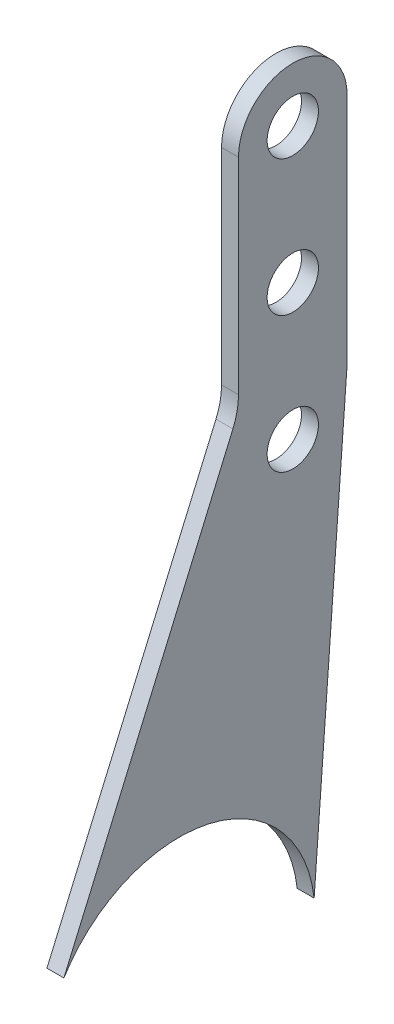
ISO-10303-21;
HEADER;
FILE_DESCRIPTION(('STEP AP214'),'2;1');
FILE_NAME('part.step','',(''),(''),'','','');
FILE_SCHEMA(('AUTOMOTIVE_DESIGN { 1 0 10303 214 1 1 1 1 }'));
ENDSEC;
DATA;
#1=APPLICATION_CONTEXT('core data for automotive mechanical design processes');
#2=APPLICATION_PROTOCOL_DEFINITION('international standard','automotive_design',2000,#1);
#3=PRODUCT_CONTEXT('',#1,'mechanical');
#4=PRODUCT('Part','Part','',(#3));
#5=PRODUCT_RELATED_PRODUCT_CATEGORY('part','',(#4));
#6=PRODUCT_DEFINITION_FORMATION('','',#4);
#7=PRODUCT_DEFINITION_CONTEXT('part definition',#1,'design');
#8=PRODUCT_DEFINITION('design','',#6,#7);
#9=PRODUCT_DEFINITION_SHAPE('','',#8);
#10=(LENGTH_UNIT() NAMED_UNIT(*) SI_UNIT(.MILLI.,.METRE.));
#11=(NAMED_UNIT(*) PLANE_ANGLE_UNIT() SI_UNIT($,.RADIAN.));
#12=(NAMED_UNIT(*) SI_UNIT($,.STERADIAN.) SOLID_ANGLE_UNIT());
#13=UNCERTAINTY_MEASURE_WITH_UNIT(LENGTH_MEASURE(1.E-05),#10,'distance_accuracy_value','');
#14=(GEOMETRIC_REPRESENTATION_CONTEXT(3) GLOBAL_UNCERTAINTY_ASSIGNED_CONTEXT((#13)) GLOBAL_UNIT_ASSIGNED_CONTEXT((#10,
#11,#12)) REPRESENTATION_CONTEXT('',''));
#15=CARTESIAN_POINT('',(0.,0.,0.));
#16=DIRECTION('',(0.,0.,1.));
#17=DIRECTION('',(1.,0.,0.));
#18=AXIS2_PLACEMENT_3D('',#15,#16,#17);
#19=CARTESIAN_POINT('',(0.79375,0.613928217814596,1.42012710191724));
#20=DIRECTION('',(0.,-0.396812698650002,-0.917899603546108));
#21=DIRECTION('',(0.,0.917899603546108,-0.396812698650002));
#22=AXIS2_PLACEMENT_3D('',#19,#20,#21);
#23=PLANE('',#22);
#24=DIRECTION('',(0.,-0.917899603546108,0.396812698650002));
#25=VECTOR('',#24,1.);
#26=CARTESIAN_POINT('',(-0.79375,0.613928217814596,1.42012710191724));
#27=LINE('',#26,#25);
#28=CARTESIAN_POINT('',(-0.79375,-9.05796836172276,5.60133751748221));
#29=VERTEX_POINT('',#28);
#30=CARTESIAN_POINT('',(-0.79375,-45.6395468899691,21.4157412285099));
#31=VERTEX_POINT('',#30);
#32=EDGE_CURVE('E132',#29,#31,#27,.T.);
#33=ORIENTED_EDGE('',*,*,#32,.T.);
#34=DIRECTION('',(-1.,0.,0.));
#35=VECTOR('',#34,1.);
#36=CARTESIAN_POINT('',(0.79375,-45.6395468899691,21.4157412285099));
#37=LINE('',#36,#35);
#38=CARTESIAN_POINT('',(0.79375,-45.6395468899691,21.4157412285099));
#39=VERTEX_POINT('',#38);
#40=EDGE_CURVE('E11',#39,#31,#37,.T.);
#41=ORIENTED_EDGE('',*,*,#40,.F.);
#42=DIRECTION('',(0.,-0.917899603546108,0.396812698650002));
#43=VECTOR('',#42,1.);
#44=CARTESIAN_POINT('',(0.79375,0.613928217814596,1.42012710191724));
#45=LINE('',#44,#43);
#46=CARTESIAN_POINT('',(0.79375,-9.05796836172276,5.60133751748221));
#47=VERTEX_POINT('',#46);
#48=EDGE_CURVE('E152',#47,#39,#45,.T.);
#49=ORIENTED_EDGE('',*,*,#48,.F.);
#50=DIRECTION('',(-1.,0.,0.));
#51=VECTOR('',#50,1.);
#52=CARTESIAN_POINT('',(0.79375,-9.05796836172276,5.60133751748221));
#53=LINE('',#52,#51);
#54=EDGE_CURVE('E128',#47,#29,#53,.T.);
#55=ORIENTED_EDGE('',*,*,#54,.T.);
#56=EDGE_LOOP('',(#33,#41,#49,#55));
#57=FACE_BOUND('',#56,.T.);
#58=ADVANCED_FACE('F37',(#57),#23,.F.);
#59=CARTESIAN_POINT('',(0.79375,-52.324,10.6172188008905));
#60=DIRECTION('',(-1.,0.,0.));
#61=DIRECTION('',(0.,0.,1.));
#62=AXIS2_PLACEMENT_3D('',#59,#60,#61);
#63=CYLINDRICAL_SURFACE('',#62,12.7);
#64=CARTESIAN_POINT('',(-0.79375,-52.324,10.6172188008905));
#65=DIRECTION('',(1.,0.,0.));
#66=DIRECTION('',(0.,0.,-1.));
#67=AXIS2_PLACEMENT_3D('',#64,#65,#66);
#68=CIRCLE('',#67,12.7);
#69=CARTESIAN_POINT('',(-0.79375,-50.8772663988758,-2.00010904169874));
#70=VERTEX_POINT('',#69);
#71=EDGE_CURVE('E135',#31,#70,#68,.F.);
#72=ORIENTED_EDGE('',*,*,#71,.T.);
#73=DIRECTION('',(-1.,0.,0.));
#74=VECTOR('',#73,1.);
#75=CARTESIAN_POINT('',(0.79375,-50.8772663988758,-2.00010904169874));
#76=LINE('',#75,#74);
#77=CARTESIAN_POINT('',(0.79375,-50.8772663988758,-2.00010904169874));
#78=VERTEX_POINT('',#77);
#79=EDGE_CURVE('E45',#78,#70,#76,.T.);
#80=ORIENTED_EDGE('',*,*,#79,.F.);
#81=CARTESIAN_POINT('',(0.79375,-52.324,10.6172188008905));
#82=DIRECTION('',(1.,0.,0.));
#83=DIRECTION('',(0.,0.,-1.));
#84=AXIS2_PLACEMENT_3D('',#81,#82,#83);
#85=CIRCLE('',#84,12.7);
#86=EDGE_CURVE('E92',#39,#78,#85,.F.);
#87=ORIENTED_EDGE('',*,*,#86,.F.);
#88=ORIENTED_EDGE('',*,*,#40,.T.);
#89=EDGE_LOOP('',(#72,#80,#87,#88));
#90=FACE_BOUND('',#89,.T.);
#91=ADVANCED_FACE('F165',(#90),#63,.F.);
#92=CARTESIAN_POINT('',(0.79375,-0.42383801796413,-5.73124783006133));
#93=DIRECTION('',(0.,-0.0737507424028265,-0.997276705831953));
#94=DIRECTION('',(0.,0.997276705831953,-0.0737507424028265));
#95=AXIS2_PLACEMENT_3D('',#92,#93,#94);
#96=PLANE('',#95);
#97=DIRECTION('',(0.,-0.997276705831953,0.0737507424028265));
#98=VECTOR('',#97,1.);
#99=CARTESIAN_POINT('',(-0.79375,-0.42383801796413,-5.73124783006133));
#100=LINE('',#99,#98);
#101=CARTESIAN_POINT('',(-0.79375,-9.46401975968267,-5.0627070820329));
#102=VERTEX_POINT('',#101);
#103=EDGE_CURVE('E139',#102,#70,#100,.T.);
#104=ORIENTED_EDGE('',*,*,#103,.F.);
#105=DIRECTION('',(-1.,0.,0.));
#106=VECTOR('',#105,1.);
#107=CARTESIAN_POINT('',(0.79375,-9.46401975968267,-5.0627070820329));
#108=LINE('',#107,#106);
#109=CARTESIAN_POINT('',(0.79375,-9.46401975968267,-5.0627070820329));
#110=VERTEX_POINT('',#109);
#111=EDGE_CURVE('E158',#110,#102,#108,.T.);
#112=ORIENTED_EDGE('',*,*,#111,.F.);
#113=DIRECTION('',(0.,-0.997276705831953,0.0737507424028265));
#114=VECTOR('',#113,1.);
#115=CARTESIAN_POINT('',(0.79375,-0.42383801796413,-5.73124783006133));
#116=LINE('',#115,#114);
#117=EDGE_CURVE('E164',#110,#78,#116,.T.);
#118=ORIENTED_EDGE('',*,*,#117,.T.);
#119=ORIENTED_EDGE('',*,*,#79,.T.);
#120=EDGE_LOOP('',(#104,#112,#118,#119));
#121=FACE_BOUND('',#120,.T.);
#122=ADVANCED_FACE('F162',(#121),#96,.T.);
#123=CARTESIAN_POINT('',(0.79375,-8.99570254542473,1.27));
#124=DIRECTION('',(-1.,0.,0.));
#125=DIRECTION('',(0.,0.,1.));
#126=AXIS2_PLACEMENT_3D('',#123,#124,#125);
#127=CYLINDRICAL_SURFACE('',#126,6.35);
#128=CARTESIAN_POINT('',(-0.79375,-8.99570254542473,1.27));
#129=DIRECTION('',(1.,0.,0.));
#130=DIRECTION('',(0.,0.,-1.));
#131=AXIS2_PLACEMENT_3D('',#128,#129,#130);
#132=CIRCLE('',#131,6.35);
#133=CARTESIAN_POINT('',(-0.79375,-8.99570254542473,-5.08));
#134=VERTEX_POINT('',#133);
#135=EDGE_CURVE('E142',#134,#102,#132,.F.);
#136=ORIENTED_EDGE('',*,*,#135,.F.);
#137=DIRECTION('',(-1.,0.,0.));
#138=VECTOR('',#137,1.);
#139=CARTESIAN_POINT('',(0.79375,-8.99570254542473,-5.08));
#140=LINE('',#139,#138);
#141=CARTESIAN_POINT('',(0.79375,-8.99570254542473,-5.08));
#142=VERTEX_POINT('',#141);
#143=EDGE_CURVE('E156',#142,#134,#140,.T.);
#144=ORIENTED_EDGE('',*,*,#143,.F.);
#145=CARTESIAN_POINT('',(0.79375,-8.99570254542473,1.27));
#146=DIRECTION('',(1.,0.,0.));
#147=DIRECTION('',(0.,0.,-1.));
#148=AXIS2_PLACEMENT_3D('',#145,#146,#147);
#149=CIRCLE('',#148,6.35);
#150=EDGE_CURVE('E175',#142,#110,#149,.F.);
#151=ORIENTED_EDGE('',*,*,#150,.T.);
#152=ORIENTED_EDGE('',*,*,#111,.T.);
#153=EDGE_LOOP('',(#136,#144,#151,#152));
#154=FACE_BOUND('',#153,.T.);
#155=ADVANCED_FACE('F173',(#154),#127,.T.);
#156=CARTESIAN_POINT('',(0.79375,0.,-5.08));
#157=DIRECTION('',(0.,0.,1.));
#158=DIRECTION('',(0.,-1.,0.));
#159=AXIS2_PLACEMENT_3D('',#156,#157,#158);
#160=PLANE('',#159);
#161=DIRECTION('',(0.,1.,0.));
#162=VECTOR('',#161,1.);
#163=CARTESIAN_POINT('',(-0.79375,0.,-5.08));
#164=LINE('',#163,#162);
#165=CARTESIAN_POINT('',(-0.79375,12.7,-5.08));
#166=VERTEX_POINT('',#165);
#167=EDGE_CURVE('E145',#134,#166,#164,.T.);
#168=ORIENTED_EDGE('',*,*,#167,.T.);
#169=DIRECTION('',(-1.,0.,0.));
#170=VECTOR('',#169,1.);
#171=CARTESIAN_POINT('',(0.79375,12.7,-5.08));
#172=LINE('',#171,#170);
#173=CARTESIAN_POINT('',(0.79375,12.7,-5.08));
#174=VERTEX_POINT('',#173);
#175=EDGE_CURVE('E117',#174,#166,#172,.T.);
#176=ORIENTED_EDGE('',*,*,#175,.F.);
#177=DIRECTION('',(0.,1.,0.));
#178=VECTOR('',#177,1.);
#179=CARTESIAN_POINT('',(0.79375,0.,-5.08));
#180=LINE('',#179,#178);
#181=EDGE_CURVE('E123',#142,#174,#180,.T.);
#182=ORIENTED_EDGE('',*,*,#181,.F.);
#183=ORIENTED_EDGE('',*,*,#143,.T.);
#184=EDGE_LOOP('',(#168,#176,#182,#183));
#185=FACE_BOUND('',#184,.T.);
#186=ADVANCED_FACE('F238',(#185),#160,.F.);
#187=CARTESIAN_POINT('',(0.79375,12.7,0.));
#188=DIRECTION('',(-1.,0.,0.));
#189=DIRECTION('',(0.,0.,1.));
#190=AXIS2_PLACEMENT_3D('',#187,#188,#189);
#191=CYLINDRICAL_SURFACE('',#190,5.08);
#192=CARTESIAN_POINT('',(-0.79375,12.7,0.));
#193=DIRECTION('',(1.,0.,0.));
#194=DIRECTION('',(0.,0.,-1.));
#195=AXIS2_PLACEMENT_3D('',#192,#193,#194);
#196=CIRCLE('',#195,5.08);
#197=CARTESIAN_POINT('',(-0.79375,12.7,5.08));
#198=VERTEX_POINT('',#197);
#199=EDGE_CURVE('E112',#198,#166,#196,.F.);
#200=ORIENTED_EDGE('',*,*,#199,.F.);
#201=DIRECTION('',(-1.,0.,0.));
#202=VECTOR('',#201,1.);
#203=CARTESIAN_POINT('',(0.79375,12.7,5.08));
#204=LINE('',#203,#202);
#205=CARTESIAN_POINT('',(0.79375,12.7,5.08));
#206=VERTEX_POINT('',#205);
#207=EDGE_CURVE('E107',#206,#198,#204,.T.);
#208=ORIENTED_EDGE('',*,*,#207,.F.);
#209=CARTESIAN_POINT('',(0.79375,12.7,0.));
#210=DIRECTION('',(1.,0.,0.));
#211=DIRECTION('',(0.,0.,-1.));
#212=AXIS2_PLACEMENT_3D('',#209,#210,#211);
#213=CIRCLE('',#212,5.08);
#214=EDGE_CURVE('E110',#206,#174,#213,.F.);
#215=ORIENTED_EDGE('',*,*,#214,.T.);
#216=ORIENTED_EDGE('',*,*,#175,.T.);
#217=EDGE_LOOP('',(#200,#208,#215,#216));
#218=FACE_BOUND('',#217,.T.);
#219=ADVANCED_FACE('F109',(#218),#191,.T.);
#220=CARTESIAN_POINT('',(0.79375,0.,5.08));
#221=DIRECTION('',(0.,0.,1.));
#222=DIRECTION('',(1.,0.,0.));
#223=AXIS2_PLACEMENT_3D('',#220,#221,#222);
#224=PLANE('',#223);
#225=DIRECTION('',(0.,1.,0.));
#226=VECTOR('',#225,1.);
#227=CARTESIAN_POINT('',(-0.79375,0.,5.08));
#228=LINE('',#227,#226);
#229=CARTESIAN_POINT('',(-0.79375,-6.53820772529525,5.08));
#230=VERTEX_POINT('',#229);
#231=EDGE_CURVE('E149',#230,#198,#228,.T.);
#232=ORIENTED_EDGE('',*,*,#231,.F.);
#233=DIRECTION('',(-1.,0.,0.));
#234=VECTOR('',#233,1.);
#235=CARTESIAN_POINT('',(0.79375,-6.53820772529525,5.08));
#236=LINE('',#235,#234);
#237=CARTESIAN_POINT('',(0.79375,-6.53820772529525,5.08));
#238=VERTEX_POINT('',#237);
#239=EDGE_CURVE('E81',#238,#230,#236,.T.);
#240=ORIENTED_EDGE('',*,*,#239,.F.);
#241=DIRECTION('',(0.,1.,0.));
#242=VECTOR('',#241,1.);
#243=CARTESIAN_POINT('',(0.79375,0.,5.08));
#244=LINE('',#243,#242);
#245=EDGE_CURVE('E120',#238,#206,#244,.T.);
#246=ORIENTED_EDGE('',*,*,#245,.T.);
#247=ORIENTED_EDGE('',*,*,#207,.T.);
#248=EDGE_LOOP('',(#232,#240,#246,#247));
#249=FACE_BOUND('',#248,.T.);
#250=ADVANCED_FACE('F126',(#249),#224,.T.);
#251=CARTESIAN_POINT('',(0.79375,-6.53820772529525,11.43));
#252=DIRECTION('',(-1.,0.,0.));
#253=DIRECTION('',(0.,0.,1.));
#254=AXIS2_PLACEMENT_3D('',#251,#252,#253);
#255=CYLINDRICAL_SURFACE('',#254,6.35);
#256=CARTESIAN_POINT('',(-0.79375,-6.53820772529525,11.43));
#257=DIRECTION('',(1.,0.,0.));
#258=DIRECTION('',(0.,0.,-1.));
#259=AXIS2_PLACEMENT_3D('',#256,#257,#258);
#260=CIRCLE('',#259,6.35);
#261=EDGE_CURVE('E84',#230,#29,#260,.F.);
#262=ORIENTED_EDGE('',*,*,#261,.T.);
#263=ORIENTED_EDGE('',*,*,#54,.F.);
#264=CARTESIAN_POINT('',(0.79375,-6.53820772529525,11.43));
#265=DIRECTION('',(1.,0.,0.));
#266=DIRECTION('',(0.,0.,-1.));
#267=AXIS2_PLACEMENT_3D('',#264,#265,#266);
#268=CIRCLE('',#267,6.35);
#269=EDGE_CURVE('E53',#238,#47,#268,.F.);
#270=ORIENTED_EDGE('',*,*,#269,.F.);
#271=ORIENTED_EDGE('',*,*,#239,.T.);
#272=EDGE_LOOP('',(#262,#263,#270,#271));
#273=FACE_BOUND('',#272,.T.);
#274=ADVANCED_FACE('F203',(#273),#255,.F.);
#275=CARTESIAN_POINT('',(0.79375,0.,0.));
#276=DIRECTION('',(1.,0.,0.));
#277=DIRECTION('',(0.,0.,-1.));
#278=AXIS2_PLACEMENT_3D('',#275,#276,#277);
#279=PLANE('',#278);
#280=CARTESIAN_POINT('',(0.793750000000001,0.,0.));
#281=DIRECTION('',(1.,0.,0.));
#282=DIRECTION('',(0.,0.,-1.));
#283=AXIS2_PLACEMENT_3D('',#280,#281,#282);
#284=CIRCLE('',#283,2.39999999999999);
#285=CARTESIAN_POINT('',(0.793750000000001,0.,-2.39999999999999));
#286=VERTEX_POINT('',#285);
#287=EDGE_CURVE('E195',#286,#286,#284,.T.);
#288=ORIENTED_EDGE('',*,*,#287,.F.);
#289=EDGE_LOOP('',(#288));
#290=FACE_BOUND('',#289,.T.);
#291=CARTESIAN_POINT('',(0.793750000000001,12.7,0.));
#292=DIRECTION('',(1.,0.,0.));
#293=DIRECTION('',(0.,0.,-1.));
#294=AXIS2_PLACEMENT_3D('',#291,#292,#293);
#295=CIRCLE('',#294,2.39999999999999);
#296=CARTESIAN_POINT('',(0.793750000000001,12.7,-2.39999999999999));
#297=VERTEX_POINT('',#296);
#298=EDGE_CURVE('E189',#297,#297,#295,.T.);
#299=ORIENTED_EDGE('',*,*,#298,.F.);
#300=EDGE_LOOP('',(#299));
#301=FACE_BOUND('',#300,.T.);
#302=CARTESIAN_POINT('',(0.793750000000001,-12.7,0.));
#303=DIRECTION('',(1.,0.,0.));
#304=DIRECTION('',(0.,0.,-1.));
#305=AXIS2_PLACEMENT_3D('',#302,#303,#304);
#306=CIRCLE('',#305,2.39999999999999);
#307=CARTESIAN_POINT('',(0.793750000000001,-12.7,-2.39999999999999));
#308=VERTEX_POINT('',#307);
#309=EDGE_CURVE('E183',#308,#308,#306,.T.);
#310=ORIENTED_EDGE('',*,*,#309,.F.);
#311=EDGE_LOOP('',(#310));
#312=FACE_BOUND('',#311,.T.);
#313=ORIENTED_EDGE('',*,*,#48,.T.);
#314=ORIENTED_EDGE('',*,*,#86,.T.);
#315=ORIENTED_EDGE('',*,*,#117,.F.);
#316=ORIENTED_EDGE('',*,*,#150,.F.);
#317=ORIENTED_EDGE('',*,*,#181,.T.);
#318=ORIENTED_EDGE('',*,*,#214,.F.);
#319=ORIENTED_EDGE('',*,*,#245,.F.);
#320=ORIENTED_EDGE('',*,*,#269,.T.);
#321=EDGE_LOOP('',(#313,#314,#315,#316,#317,#318,#319,#320));
#322=FACE_BOUND('',#321,.T.);
#323=ADVANCED_FACE('F119',(#290,#301,#312,#322),#279,.T.);
#324=CARTESIAN_POINT('',(-0.79375,0.,0.));
#325=DIRECTION('',(1.,0.,0.));
#326=DIRECTION('',(0.,0.,-1.));
#327=AXIS2_PLACEMENT_3D('',#324,#325,#326);
#328=PLANE('',#327);
#329=CARTESIAN_POINT('',(-0.79375,0.,0.));
#330=DIRECTION('',(1.,0.,0.));
#331=DIRECTION('',(0.,0.,-1.));
#332=AXIS2_PLACEMENT_3D('',#329,#330,#331);
#333=CIRCLE('',#332,2.39999999999999);
#334=CARTESIAN_POINT('',(-0.79375,0.,-2.39999999999999));
#335=VERTEX_POINT('',#334);
#336=EDGE_CURVE('E192',#335,#335,#333,.T.);
#337=ORIENTED_EDGE('',*,*,#336,.T.);
#338=EDGE_LOOP('',(#337));
#339=FACE_BOUND('',#338,.T.);
#340=CARTESIAN_POINT('',(-0.79375,12.7,0.));
#341=DIRECTION('',(1.,0.,0.));
#342=DIRECTION('',(0.,0.,-1.));
#343=AXIS2_PLACEMENT_3D('',#340,#341,#342);
#344=CIRCLE('',#343,2.39999999999999);
#345=CARTESIAN_POINT('',(-0.79375,12.7,-2.39999999999999));
#346=VERTEX_POINT('',#345);
#347=EDGE_CURVE('E186',#346,#346,#344,.T.);
#348=ORIENTED_EDGE('',*,*,#347,.T.);
#349=EDGE_LOOP('',(#348));
#350=FACE_BOUND('',#349,.T.);
#351=CARTESIAN_POINT('',(-0.79375,-12.7,0.));
#352=DIRECTION('',(1.,0.,0.));
#353=DIRECTION('',(0.,0.,-1.));
#354=AXIS2_PLACEMENT_3D('',#351,#352,#353);
#355=CIRCLE('',#354,2.39999999999999);
#356=CARTESIAN_POINT('',(-0.79375,-12.7,-2.39999999999999));
#357=VERTEX_POINT('',#356);
#358=EDGE_CURVE('E136',#357,#357,#355,.T.);
#359=ORIENTED_EDGE('',*,*,#358,.T.);
#360=EDGE_LOOP('',(#359));
#361=FACE_BOUND('',#360,.T.);
#362=ORIENTED_EDGE('',*,*,#32,.F.);
#363=ORIENTED_EDGE('',*,*,#261,.F.);
#364=ORIENTED_EDGE('',*,*,#231,.T.);
#365=ORIENTED_EDGE('',*,*,#199,.T.);
#366=ORIENTED_EDGE('',*,*,#167,.F.);
#367=ORIENTED_EDGE('',*,*,#135,.T.);
#368=ORIENTED_EDGE('',*,*,#103,.T.);
#369=ORIENTED_EDGE('',*,*,#71,.F.);
#370=EDGE_LOOP('',(#362,#363,#364,#365,#366,#367,#368,#369));
#371=FACE_BOUND('',#370,.T.);
#372=ADVANCED_FACE('F169',(#339,#350,#361,#371),#328,.F.);
#373=CARTESIAN_POINT('',(0.79375,-12.7,0.));
#374=DIRECTION('',(1.,0.,0.));
#375=DIRECTION('',(0.,0.,-1.));
#376=AXIS2_PLACEMENT_3D('',#373,#374,#375);
#377=CYLINDRICAL_SURFACE('',#376,2.39999999999999);
#378=ORIENTED_EDGE('',*,*,#358,.F.);
#379=EDGE_LOOP('',(#378));
#380=FACE_BOUND('',#379,.T.);
#381=ORIENTED_EDGE('',*,*,#309,.T.);
#382=EDGE_LOOP('',(#381));
#383=FACE_BOUND('',#382,.T.);
#384=ADVANCED_FACE('F209',(#380,#383),#377,.F.);
#385=CARTESIAN_POINT('',(0.79375,12.7,0.));
#386=DIRECTION('',(1.,0.,0.));
#387=DIRECTION('',(0.,0.,-1.));
#388=AXIS2_PLACEMENT_3D('',#385,#386,#387);
#389=CYLINDRICAL_SURFACE('',#388,2.39999999999999);
#390=ORIENTED_EDGE('',*,*,#347,.F.);
#391=EDGE_LOOP('',(#390));
#392=FACE_BOUND('',#391,.T.);
#393=ORIENTED_EDGE('',*,*,#298,.T.);
#394=EDGE_LOOP('',(#393));
#395=FACE_BOUND('',#394,.T.);
#396=ADVANCED_FACE('F211',(#392,#395),#389,.F.);
#397=CARTESIAN_POINT('',(0.79375,0.,0.));
#398=DIRECTION('',(1.,0.,0.));
#399=DIRECTION('',(0.,0.,-1.));
#400=AXIS2_PLACEMENT_3D('',#397,#398,#399);
#401=CYLINDRICAL_SURFACE('',#400,2.39999999999999);
#402=ORIENTED_EDGE('',*,*,#336,.F.);
#403=EDGE_LOOP('',(#402));
#404=FACE_BOUND('',#403,.T.);
#405=ORIENTED_EDGE('',*,*,#287,.T.);
#406=EDGE_LOOP('',(#405));
#407=FACE_BOUND('',#406,.T.);
#408=ADVANCED_FACE('F199',(#404,#407),#401,.F.);
#409=CLOSED_SHELL('',(#58,#91,#122,#155,#186,#219,#250,#274,#323,#372,#384,#396,#408));
#410=MANIFOLD_SOLID_BREP('B2',#409);
#411=ADVANCED_BREP_SHAPE_REPRESENTATION('',(#18,#410),#14);
#412=SHAPE_DEFINITION_REPRESENTATION(#9,#411);
ENDSEC;
END-ISO-10303-21;
